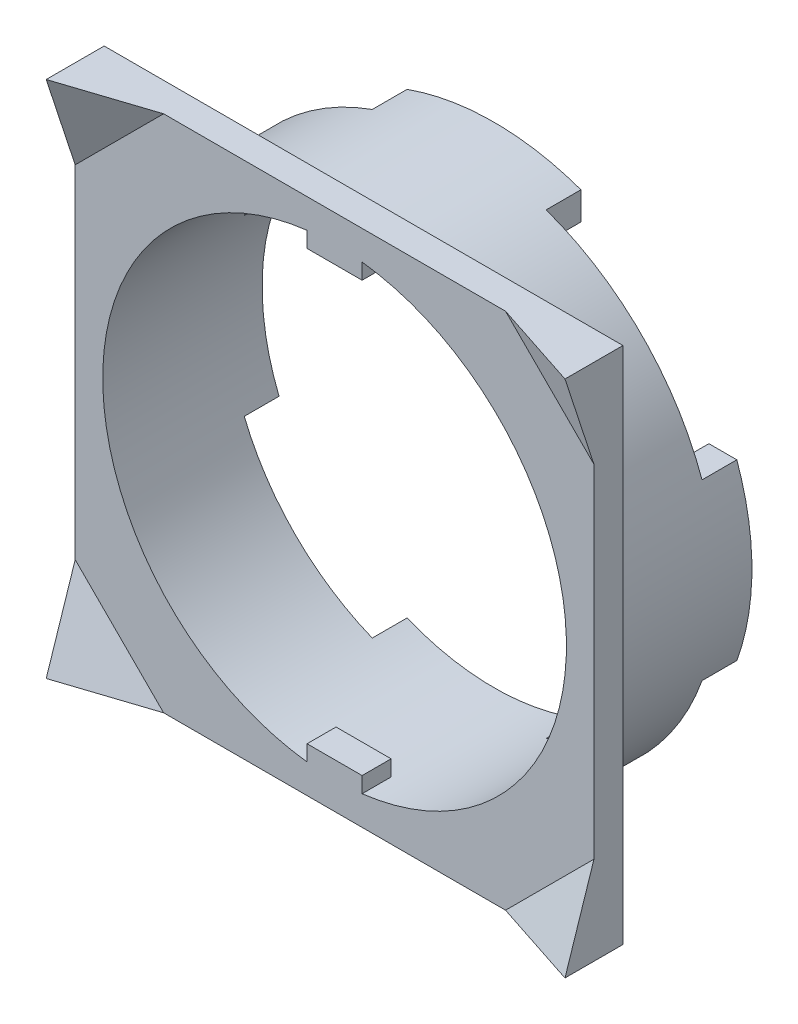
ISO-10303-21;
HEADER;
FILE_DESCRIPTION(('STEP AP214'),'2;1');
FILE_NAME('part.step','',(''),(''),'','','');
FILE_SCHEMA(('AUTOMOTIVE_DESIGN { 1 0 10303 214 1 1 1 1 }'));
ENDSEC;
DATA;
#1=APPLICATION_CONTEXT('core data for automotive mechanical design processes');
#2=APPLICATION_PROTOCOL_DEFINITION('international standard','automotive_design',2000,#1);
#3=PRODUCT_CONTEXT('',#1,'mechanical');
#4=PRODUCT('Part','Part','',(#3));
#5=PRODUCT_RELATED_PRODUCT_CATEGORY('part','',(#4));
#6=PRODUCT_DEFINITION_FORMATION('','',#4);
#7=PRODUCT_DEFINITION_CONTEXT('part definition',#1,'design');
#8=PRODUCT_DEFINITION('design','',#6,#7);
#9=PRODUCT_DEFINITION_SHAPE('','',#8);
#10=(LENGTH_UNIT() NAMED_UNIT(*) SI_UNIT(.MILLI.,.METRE.));
#11=(NAMED_UNIT(*) PLANE_ANGLE_UNIT() SI_UNIT($,.RADIAN.));
#12=(NAMED_UNIT(*) SI_UNIT($,.STERADIAN.) SOLID_ANGLE_UNIT());
#13=UNCERTAINTY_MEASURE_WITH_UNIT(LENGTH_MEASURE(1.E-05),#10,'distance_accuracy_value','');
#14=(GEOMETRIC_REPRESENTATION_CONTEXT(3) GLOBAL_UNCERTAINTY_ASSIGNED_CONTEXT((#13)) GLOBAL_UNIT_ASSIGNED_CONTEXT((#10,
#11,#12)) REPRESENTATION_CONTEXT('',''));
#15=CARTESIAN_POINT('',(0.,0.,0.));
#16=DIRECTION('',(0.,0.,1.));
#17=DIRECTION('',(1.,0.,0.));
#18=AXIS2_PLACEMENT_3D('',#15,#16,#17);
#19=CARTESIAN_POINT('',(-8.94999999999999,-8.95,3.3));
#20=DIRECTION('',(0.,0.,1.));
#21=DIRECTION('',(1.,0.,0.));
#22=AXIS2_PLACEMENT_3D('',#19,#20,#21);
#23=PLANE('',#22);
#24=DIRECTION('',(0.,1.,0.));
#25=VECTOR('',#24,1.);
#26=CARTESIAN_POINT('',(8.95,-8.95,3.3));
#27=LINE('',#26,#25);
#28=CARTESIAN_POINT('',(8.95,-8.94999999999998,3.3));
#29=VERTEX_POINT('',#28);
#30=CARTESIAN_POINT('',(8.95,8.95,3.3));
#31=VERTEX_POINT('',#30);
#32=EDGE_CURVE('E269',#29,#31,#27,.T.);
#33=ORIENTED_EDGE('',*,*,#32,.F.);
#34=DIRECTION('',(1.,0.,0.));
#35=VECTOR('',#34,1.);
#36=CARTESIAN_POINT('',(8.95,-8.95,3.3));
#37=LINE('',#36,#35);
#38=CARTESIAN_POINT('',(-8.94999999999999,-8.95,3.3));
#39=VERTEX_POINT('',#38);
#40=EDGE_CURVE('E281',#39,#29,#37,.T.);
#41=ORIENTED_EDGE('',*,*,#40,.F.);
#42=DIRECTION('',(0.,1.,0.));
#43=VECTOR('',#42,1.);
#44=CARTESIAN_POINT('',(-8.95,-8.95,3.3));
#45=LINE('',#44,#43);
#46=CARTESIAN_POINT('',(-8.95,8.94999999999999,3.3));
#47=VERTEX_POINT('',#46);
#48=EDGE_CURVE('E293',#47,#39,#45,.F.);
#49=ORIENTED_EDGE('',*,*,#48,.F.);
#50=DIRECTION('',(-1.,0.,0.));
#51=VECTOR('',#50,1.);
#52=CARTESIAN_POINT('',(8.95,8.95,3.3));
#53=LINE('',#52,#51);
#54=EDGE_CURVE('E254',#31,#47,#53,.T.);
#55=ORIENTED_EDGE('',*,*,#54,.F.);
#56=EDGE_LOOP('',(#33,#41,#49,#55));
#57=FACE_BOUND('',#56,.T.);
#58=CARTESIAN_POINT('',(0.,0.,3.3));
#59=DIRECTION('',(0.,0.,-1.));
#60=DIRECTION('',(-1.,0.,0.));
#61=AXIS2_PLACEMENT_3D('',#58,#59,#60);
#62=CIRCLE('',#61,8.9);
#63=CARTESIAN_POINT('',(-8.9,0.,3.3));
#64=VERTEX_POINT('',#63);
#65=EDGE_CURVE('E377',#64,#64,#62,.T.);
#66=ORIENTED_EDGE('',*,*,#65,.F.);
#67=EDGE_LOOP('',(#66));
#68=FACE_BOUND('',#67,.T.);
#69=ADVANCED_FACE('F15',(#57,#68),#23,.F.);
#70=CARTESIAN_POINT('',(-8.95,-8.95,3.3));
#71=DIRECTION('',(-1.,0.,0.));
#72=DIRECTION('',(0.,0.,1.));
#73=AXIS2_PLACEMENT_3D('',#70,#71,#72);
#74=PLANE('',#73);
#75=DIRECTION('',(0.,0.,1.));
#76=VECTOR('',#75,1.);
#77=CARTESIAN_POINT('',(-8.95,8.95,3.3));
#78=LINE('',#77,#76);
#79=CARTESIAN_POINT('',(-8.95,8.94999999999998,5.29999999999999));
#80=VERTEX_POINT('',#79);
#81=EDGE_CURVE('E263',#47,#80,#78,.T.);
#82=ORIENTED_EDGE('',*,*,#81,.F.);
#83=ORIENTED_EDGE('',*,*,#48,.T.);
#84=DIRECTION('',(0.,0.,1.));
#85=VECTOR('',#84,1.);
#86=CARTESIAN_POINT('',(-8.94999999999995,-8.95,3.3));
#87=LINE('',#86,#85);
#88=CARTESIAN_POINT('',(-8.94999999999997,-8.95000000000001,5.29999999999999));
#89=VERTEX_POINT('',#88);
#90=EDGE_CURVE('E284',#89,#39,#87,.F.);
#91=ORIENTED_EDGE('',*,*,#90,.F.);
#92=DIRECTION('',(0.,0.950252443169309,-0.31148080880009));
#93=VECTOR('',#92,1.);
#94=CARTESIAN_POINT('',(-8.94999999999995,-5.68037081965467,4.22825664496724));
#95=LINE('',#94,#93);
#96=CARTESIAN_POINT('',(-8.94999999999999,-5.89924240491755,4.3));
#97=VERTEX_POINT('',#96);
#98=EDGE_CURVE('E290',#89,#97,#95,.T.);
#99=ORIENTED_EDGE('',*,*,#98,.T.);
#100=DIRECTION('',(0.,1.,0.));
#101=VECTOR('',#100,1.);
#102=CARTESIAN_POINT('',(-8.95,-8.95,4.3));
#103=LINE('',#102,#101);
#104=CARTESIAN_POINT('',(-8.95,5.8992424049175,4.3));
#105=VERTEX_POINT('',#104);
#106=EDGE_CURVE('E245',#105,#97,#103,.F.);
#107=ORIENTED_EDGE('',*,*,#106,.F.);
#108=DIRECTION('',(0.,0.950252443169309,0.31148080880009));
#109=VECTOR('',#108,1.);
#110=CARTESIAN_POINT('',(-8.95,5.8992424049175,4.3));
#111=LINE('',#110,#109);
#112=EDGE_CURVE('E251',#105,#80,#111,.T.);
#113=ORIENTED_EDGE('',*,*,#112,.T.);
#114=EDGE_LOOP('',(#82,#83,#91,#99,#107,#113));
#115=FACE_BOUND('',#114,.T.);
#116=ADVANCED_FACE('F813',(#115),#74,.T.);
#117=CARTESIAN_POINT('',(-9.19238815542509,-5.65685424949243,4.3));
#118=DIRECTION('',(-0.297388357870725,-0.297388357870728,-0.907259791463231));
#119=DIRECTION('',(0.,0.950252443169309,-0.31148080880009));
#120=AXIS2_PLACEMENT_3D('',#117,#118,#119);
#121=PLANE('',#120);
#122=DIRECTION('',(-0.950252443169311,0.,0.311480808800087));
#123=VECTOR('',#122,1.);
#124=CARTESIAN_POINT('',(-5.89924240491746,-8.95,4.3));
#125=LINE('',#124,#123);
#126=CARTESIAN_POINT('',(-5.89924240491747,-8.95000000000002,4.3));
#127=VERTEX_POINT('',#126);
#128=EDGE_CURVE('E287',#127,#89,#125,.T.);
#129=ORIENTED_EDGE('',*,*,#128,.F.);
#130=DIRECTION('',(0.707106781186554,-0.707106781186541,0.));
#131=VECTOR('',#130,1.);
#132=CARTESIAN_POINT('',(-8.94999999999998,-5.89924240491755,4.3));
#133=LINE('',#132,#131);
#134=EDGE_CURVE('E450',#97,#127,#133,.T.);
#135=ORIENTED_EDGE('',*,*,#134,.F.);
#136=ORIENTED_EDGE('',*,*,#98,.F.);
#137=EDGE_LOOP('',(#129,#135,#136));
#138=FACE_BOUND('',#137,.T.);
#139=ADVANCED_FACE('F804',(#138),#121,.F.);
#140=CARTESIAN_POINT('',(8.95,-8.95,3.3));
#141=DIRECTION('',(0.,-1.,0.));
#142=DIRECTION('',(1.,0.,0.));
#143=AXIS2_PLACEMENT_3D('',#140,#141,#142);
#144=PLANE('',#143);
#145=ORIENTED_EDGE('',*,*,#90,.T.);
#146=ORIENTED_EDGE('',*,*,#40,.T.);
#147=DIRECTION('',(0.,0.,1.));
#148=VECTOR('',#147,1.);
#149=CARTESIAN_POINT('',(8.95,-8.94999999999993,3.3));
#150=LINE('',#149,#148);
#151=CARTESIAN_POINT('',(8.95000000000002,-8.94999999999995,5.29999999999999));
#152=VERTEX_POINT('',#151);
#153=EDGE_CURVE('E272',#152,#29,#150,.F.);
#154=ORIENTED_EDGE('',*,*,#153,.F.);
#155=DIRECTION('',(-0.950252443169309,0.,-0.311480808800091));
#156=VECTOR('',#155,1.);
#157=CARTESIAN_POINT('',(5.6803708196547,-8.94999999999993,4.22825664496724));
#158=LINE('',#157,#156);
#159=CARTESIAN_POINT('',(5.89924240491754,-8.94999999999999,4.3));
#160=VERTEX_POINT('',#159);
#161=EDGE_CURVE('E278',#152,#160,#158,.T.);
#162=ORIENTED_EDGE('',*,*,#161,.T.);
#163=DIRECTION('',(1.,0.,0.));
#164=VECTOR('',#163,1.);
#165=CARTESIAN_POINT('',(-8.94999999999999,-8.95000000000002,4.3));
#166=LINE('',#165,#164);
#167=EDGE_CURVE('E447',#127,#160,#166,.T.);
#168=ORIENTED_EDGE('',*,*,#167,.F.);
#169=ORIENTED_EDGE('',*,*,#128,.T.);
#170=EDGE_LOOP('',(#145,#146,#154,#162,#168,#169));
#171=FACE_BOUND('',#170,.T.);
#172=ADVANCED_FACE('F795',(#171),#144,.T.);
#173=CARTESIAN_POINT('',(5.65685424949246,-9.19238815542507,4.3));
#174=DIRECTION('',(0.297388357870729,-0.297388357870724,-0.907259791463231));
#175=DIRECTION('',(-0.950252443169309,0.,-0.311480808800091));
#176=AXIS2_PLACEMENT_3D('',#173,#174,#175);
#177=PLANE('',#176);
#178=DIRECTION('',(0.,-0.950252443169309,0.31148080880009));
#179=VECTOR('',#178,1.);
#180=CARTESIAN_POINT('',(8.95,-5.89924240491747,4.3));
#181=LINE('',#180,#179);
#182=CARTESIAN_POINT('',(8.95,-5.89924240491747,4.3));
#183=VERTEX_POINT('',#182);
#184=EDGE_CURVE('E275',#183,#152,#181,.T.);
#185=ORIENTED_EDGE('',*,*,#184,.F.);
#186=DIRECTION('',(0.707106781186541,0.707106781186554,0.));
#187=VECTOR('',#186,1.);
#188=CARTESIAN_POINT('',(5.89924240491754,-8.94999999999999,4.3));
#189=LINE('',#188,#187);
#190=EDGE_CURVE('E444',#160,#183,#189,.T.);
#191=ORIENTED_EDGE('',*,*,#190,.F.);
#192=ORIENTED_EDGE('',*,*,#161,.F.);
#193=EDGE_LOOP('',(#185,#191,#192));
#194=FACE_BOUND('',#193,.T.);
#195=ADVANCED_FACE('F786',(#194),#177,.F.);
#196=CARTESIAN_POINT('',(8.95,-8.95,3.3));
#197=DIRECTION('',(1.,0.,0.));
#198=DIRECTION('',(0.,1.,0.));
#199=AXIS2_PLACEMENT_3D('',#196,#197,#198);
#200=PLANE('',#199);
#201=ORIENTED_EDGE('',*,*,#153,.T.);
#202=ORIENTED_EDGE('',*,*,#32,.T.);
#203=DIRECTION('',(0.,0.,1.));
#204=VECTOR('',#203,1.);
#205=CARTESIAN_POINT('',(8.95,8.95,3.3));
#206=LINE('',#205,#204);
#207=CARTESIAN_POINT('',(8.95,8.95,5.3));
#208=VERTEX_POINT('',#207);
#209=EDGE_CURVE('E257',#208,#31,#206,.F.);
#210=ORIENTED_EDGE('',*,*,#209,.F.);
#211=DIRECTION('',(0.,-0.95025244316931,-0.311480808800088));
#212=VECTOR('',#211,1.);
#213=CARTESIAN_POINT('',(8.95,8.95,5.3));
#214=LINE('',#213,#212);
#215=CARTESIAN_POINT('',(8.95,5.89924240491749,4.3));
#216=VERTEX_POINT('',#215);
#217=EDGE_CURVE('E266',#208,#216,#214,.T.);
#218=ORIENTED_EDGE('',*,*,#217,.T.);
#219=DIRECTION('',(0.,1.,0.));
#220=VECTOR('',#219,1.);
#221=CARTESIAN_POINT('',(8.95,-8.95,4.3));
#222=LINE('',#221,#220);
#223=EDGE_CURVE('E441',#183,#216,#222,.T.);
#224=ORIENTED_EDGE('',*,*,#223,.F.);
#225=ORIENTED_EDGE('',*,*,#184,.T.);
#226=EDGE_LOOP('',(#201,#202,#210,#218,#224,#225));
#227=FACE_BOUND('',#226,.T.);
#228=ADVANCED_FACE('F777',(#227),#200,.T.);
#229=CARTESIAN_POINT('',(9.19238815542513,5.65685424949236,4.3));
#230=DIRECTION('',(0.297388357870727,0.297388357870726,-0.907259791463231));
#231=DIRECTION('',(-0.95025244316931,0.,-0.311480808800089));
#232=AXIS2_PLACEMENT_3D('',#229,#230,#231);
#233=PLANE('',#232);
#234=DIRECTION('',(0.95025244316931,0.,0.311480808800089));
#235=VECTOR('',#234,1.);
#236=CARTESIAN_POINT('',(5.8992424049175,8.95,4.3));
#237=LINE('',#236,#235);
#238=CARTESIAN_POINT('',(5.8992424049175,8.95,4.3));
#239=VERTEX_POINT('',#238);
#240=EDGE_CURVE('E260',#239,#208,#237,.T.);
#241=ORIENTED_EDGE('',*,*,#240,.F.);
#242=DIRECTION('',(-0.707106781186548,0.707106781186548,0.));
#243=VECTOR('',#242,1.);
#244=CARTESIAN_POINT('',(8.95,5.8992424049175,4.3));
#245=LINE('',#244,#243);
#246=EDGE_CURVE('E438',#216,#239,#245,.T.);
#247=ORIENTED_EDGE('',*,*,#246,.F.);
#248=ORIENTED_EDGE('',*,*,#217,.F.);
#249=EDGE_LOOP('',(#241,#247,#248));
#250=FACE_BOUND('',#249,.T.);
#251=ADVANCED_FACE('F768',(#250),#233,.F.);
#252=CARTESIAN_POINT('',(8.95,8.95,3.3));
#253=DIRECTION('',(0.,1.,0.));
#254=DIRECTION('',(-1.,0.,0.));
#255=AXIS2_PLACEMENT_3D('',#252,#253,#254);
#256=PLANE('',#255);
#257=ORIENTED_EDGE('',*,*,#209,.T.);
#258=ORIENTED_EDGE('',*,*,#54,.T.);
#259=ORIENTED_EDGE('',*,*,#81,.T.);
#260=DIRECTION('',(-0.95025244316931,0.,0.311480808800089));
#261=VECTOR('',#260,1.);
#262=CARTESIAN_POINT('',(-5.68037081965464,8.94999999999998,4.22825664496724));
#263=LINE('',#262,#261);
#264=CARTESIAN_POINT('',(-5.89924240491752,8.94999999999999,4.3));
#265=VERTEX_POINT('',#264);
#266=EDGE_CURVE('E241',#80,#265,#263,.F.);
#267=ORIENTED_EDGE('',*,*,#266,.T.);
#268=DIRECTION('',(1.,0.,0.));
#269=VECTOR('',#268,1.);
#270=CARTESIAN_POINT('',(-8.94999999999999,8.95,4.3));
#271=LINE('',#270,#269);
#272=EDGE_CURVE('E436',#239,#265,#271,.F.);
#273=ORIENTED_EDGE('',*,*,#272,.F.);
#274=ORIENTED_EDGE('',*,*,#240,.T.);
#275=EDGE_LOOP('',(#257,#258,#259,#267,#273,#274));
#276=FACE_BOUND('',#275,.T.);
#277=ADVANCED_FACE('F759',(#276),#256,.T.);
#278=CARTESIAN_POINT('',(-5.65685424949239,9.19238815542511,4.3));
#279=DIRECTION('',(-0.297388357870727,0.297388357870726,-0.907259791463231));
#280=DIRECTION('',(-0.95025244316931,0.,0.311480808800089));
#281=AXIS2_PLACEMENT_3D('',#278,#279,#280);
#282=PLANE('',#281);
#283=ORIENTED_EDGE('',*,*,#112,.F.);
#284=DIRECTION('',(-0.707106781186547,-0.707106781186548,0.));
#285=VECTOR('',#284,1.);
#286=CARTESIAN_POINT('',(-5.89924240491751,8.94999999999999,4.3));
#287=LINE('',#286,#285);
#288=EDGE_CURVE('E431',#265,#105,#287,.T.);
#289=ORIENTED_EDGE('',*,*,#288,.F.);
#290=ORIENTED_EDGE('',*,*,#266,.F.);
#291=EDGE_LOOP('',(#283,#289,#290));
#292=FACE_BOUND('',#291,.T.);
#293=ADVANCED_FACE('F751',(#292),#282,.F.);
#294=CARTESIAN_POINT('',(0.95,7.4,3.3));
#295=DIRECTION('',(0.,1.,0.));
#296=DIRECTION('',(0.,0.,1.));
#297=AXIS2_PLACEMENT_3D('',#294,#295,#296);
#298=PLANE('',#297);
#299=DIRECTION('',(1.,0.,0.));
#300=VECTOR('',#299,1.);
#301=CARTESIAN_POINT('',(0.,7.4,3.3));
#302=LINE('',#301,#300);
#303=CARTESIAN_POINT('',(-0.95,7.4,3.3));
#304=VERTEX_POINT('',#303);
#305=CARTESIAN_POINT('',(0.95,7.4,3.3));
#306=VERTEX_POINT('',#305);
#307=EDGE_CURVE('E161',#304,#306,#302,.T.);
#308=ORIENTED_EDGE('',*,*,#307,.T.);
#309=DIRECTION('',(0.,0.,1.));
#310=VECTOR('',#309,1.);
#311=CARTESIAN_POINT('',(0.95,7.4,3.3));
#312=LINE('',#311,#310);
#313=CARTESIAN_POINT('',(0.95,7.4,4.3));
#314=VERTEX_POINT('',#313);
#315=EDGE_CURVE('E228',#306,#314,#312,.T.);
#316=ORIENTED_EDGE('',*,*,#315,.T.);
#317=DIRECTION('',(1.,0.,0.));
#318=VECTOR('',#317,1.);
#319=CARTESIAN_POINT('',(-8.94999999999999,7.4,4.3));
#320=LINE('',#319,#318);
#321=CARTESIAN_POINT('',(-0.95,7.4,4.3));
#322=VERTEX_POINT('',#321);
#323=EDGE_CURVE('E234',#322,#314,#320,.T.);
#324=ORIENTED_EDGE('',*,*,#323,.F.);
#325=DIRECTION('',(0.,0.,1.));
#326=VECTOR('',#325,1.);
#327=CARTESIAN_POINT('',(-0.95,7.4,3.3));
#328=LINE('',#327,#326);
#329=EDGE_CURVE('E174',#322,#304,#328,.F.);
#330=ORIENTED_EDGE('',*,*,#329,.T.);
#331=EDGE_LOOP('',(#308,#316,#324,#330));
#332=FACE_BOUND('',#331,.T.);
#333=ADVANCED_FACE('F519',(#332),#298,.F.);
#334=CARTESIAN_POINT('',(0.950000000000001,-7.4,3.3));
#335=DIRECTION('',(0.,-1.,0.));
#336=DIRECTION('',(0.,0.,-1.));
#337=AXIS2_PLACEMENT_3D('',#334,#335,#336);
#338=PLANE('',#337);
#339=DIRECTION('',(1.,0.,0.));
#340=VECTOR('',#339,1.);
#341=CARTESIAN_POINT('',(0.,-7.4,3.3));
#342=LINE('',#341,#340);
#343=CARTESIAN_POINT('',(0.95,-7.4,3.3));
#344=VERTEX_POINT('',#343);
#345=CARTESIAN_POINT('',(-0.950000000000001,-7.4,3.3));
#346=VERTEX_POINT('',#345);
#347=EDGE_CURVE('E296',#344,#346,#342,.F.);
#348=ORIENTED_EDGE('',*,*,#347,.T.);
#349=DIRECTION('',(0.,0.,1.));
#350=VECTOR('',#349,1.);
#351=CARTESIAN_POINT('',(-0.950000000000001,-7.4,3.3));
#352=LINE('',#351,#350);
#353=CARTESIAN_POINT('',(-0.950000000000001,-7.4,4.3));
#354=VERTEX_POINT('',#353);
#355=EDGE_CURVE('E184',#346,#354,#352,.T.);
#356=ORIENTED_EDGE('',*,*,#355,.T.);
#357=DIRECTION('',(1.,0.,0.));
#358=VECTOR('',#357,1.);
#359=CARTESIAN_POINT('',(-8.94999999999999,-7.4,4.3));
#360=LINE('',#359,#358);
#361=CARTESIAN_POINT('',(0.95,-7.4,4.3));
#362=VERTEX_POINT('',#361);
#363=EDGE_CURVE('E212',#362,#354,#360,.F.);
#364=ORIENTED_EDGE('',*,*,#363,.F.);
#365=DIRECTION('',(0.,0.,1.));
#366=VECTOR('',#365,1.);
#367=CARTESIAN_POINT('',(0.950000000000001,-7.4,3.3));
#368=LINE('',#367,#366);
#369=EDGE_CURVE('E199',#362,#344,#368,.F.);
#370=ORIENTED_EDGE('',*,*,#369,.T.);
#371=EDGE_LOOP('',(#348,#356,#364,#370));
#372=FACE_BOUND('',#371,.T.);
#373=ADVANCED_FACE('F217',(#372),#338,.F.);
#374=CARTESIAN_POINT('',(-0.95,7.94339348137809,3.3));
#375=DIRECTION('',(1.,0.,0.));
#376=DIRECTION('',(0.,1.,0.));
#377=AXIS2_PLACEMENT_3D('',#374,#375,#376);
#378=PLANE('',#377);
#379=DIRECTION('',(0.,1.,0.));
#380=VECTOR('',#379,1.);
#381=CARTESIAN_POINT('',(-0.95,0.,3.3));
#382=LINE('',#381,#380);
#383=CARTESIAN_POINT('',(-0.95,7.94339348137809,3.3));
#384=VERTEX_POINT('',#383);
#385=EDGE_CURVE('E240',#384,#304,#382,.F.);
#386=ORIENTED_EDGE('',*,*,#385,.T.);
#387=ORIENTED_EDGE('',*,*,#329,.F.);
#388=DIRECTION('',(0.,1.,0.));
#389=VECTOR('',#388,1.);
#390=CARTESIAN_POINT('',(-0.95,-8.95,4.3));
#391=LINE('',#390,#389);
#392=CARTESIAN_POINT('',(-0.95,7.94339348137809,4.3));
#393=VERTEX_POINT('',#392);
#394=EDGE_CURVE('E236',#393,#322,#391,.F.);
#395=ORIENTED_EDGE('',*,*,#394,.F.);
#396=DIRECTION('',(0.,0.,1.));
#397=VECTOR('',#396,1.);
#398=CARTESIAN_POINT('',(-0.95,7.94339348137809,-1.2));
#399=LINE('',#398,#397);
#400=EDGE_CURVE('E218',#393,#384,#399,.F.);
#401=ORIENTED_EDGE('',*,*,#400,.T.);
#402=EDGE_LOOP('',(#386,#387,#395,#401));
#403=FACE_BOUND('',#402,.T.);
#404=ADVANCED_FACE('F506',(#403),#378,.F.);
#405=CARTESIAN_POINT('',(0.,0.,3.3));
#406=DIRECTION('',(0.,0.,1.));
#407=DIRECTION('',(1.,0.,0.));
#408=AXIS2_PLACEMENT_3D('',#405,#406,#407);
#409=PLANE('',#408);
#410=ORIENTED_EDGE('',*,*,#307,.F.);
#411=ORIENTED_EDGE('',*,*,#385,.F.);
#412=CARTESIAN_POINT('',(0.,0.,3.3));
#413=DIRECTION('',(0.,0.,1.));
#414=DIRECTION('',(1.,0.,0.));
#415=AXIS2_PLACEMENT_3D('',#412,#413,#414);
#416=CIRCLE('',#415,8.);
#417=CARTESIAN_POINT('',(0.95,7.94339348137809,3.3));
#418=VERTEX_POINT('',#417);
#419=EDGE_CURVE('E221',#384,#418,#416,.F.);
#420=ORIENTED_EDGE('',*,*,#419,.T.);
#421=DIRECTION('',(0.,-1.,0.));
#422=VECTOR('',#421,1.);
#423=CARTESIAN_POINT('',(0.95,7.94339348137809,3.3));
#424=LINE('',#423,#422);
#425=EDGE_CURVE('E231',#418,#306,#424,.T.);
#426=ORIENTED_EDGE('',*,*,#425,.T.);
#427=EDGE_LOOP('',(#410,#411,#420,#426));
#428=FACE_BOUND('',#427,.T.);
#429=ADVANCED_FACE('F510',(#428),#409,.F.);
#430=CARTESIAN_POINT('',(0.95,7.94339348137809,3.3));
#431=DIRECTION('',(-1.,0.,0.));
#432=DIRECTION('',(0.,-1.,0.));
#433=AXIS2_PLACEMENT_3D('',#430,#431,#432);
#434=PLANE('',#433);
#435=ORIENTED_EDGE('',*,*,#425,.F.);
#436=DIRECTION('',(0.,0.,1.));
#437=VECTOR('',#436,1.);
#438=CARTESIAN_POINT('',(0.950000000000001,7.94339348137809,-1.2));
#439=LINE('',#438,#437);
#440=CARTESIAN_POINT('',(0.95,7.94339348137809,4.3));
#441=VERTEX_POINT('',#440);
#442=EDGE_CURVE('E367',#418,#441,#439,.T.);
#443=ORIENTED_EDGE('',*,*,#442,.T.);
#444=DIRECTION('',(0.,1.,0.));
#445=VECTOR('',#444,1.);
#446=CARTESIAN_POINT('',(0.95,-8.95,4.3));
#447=LINE('',#446,#445);
#448=EDGE_CURVE('E215',#314,#441,#447,.T.);
#449=ORIENTED_EDGE('',*,*,#448,.F.);
#450=ORIENTED_EDGE('',*,*,#315,.F.);
#451=EDGE_LOOP('',(#435,#443,#449,#450));
#452=FACE_BOUND('',#451,.T.);
#453=ADVANCED_FACE('F517',(#452),#434,.F.);
#454=CARTESIAN_POINT('',(8.37914076740569,2.99999999999996,-1.2));
#455=DIRECTION('',(0.,-1.,0.));
#456=DIRECTION('',(1.,0.,0.));
#457=AXIS2_PLACEMENT_3D('',#454,#455,#456);
#458=PLANE('',#457);
#459=DIRECTION('',(1.,0.,0.));
#460=VECTOR('',#459,1.);
#461=CARTESIAN_POINT('',(0.,2.99999999999996,-1.2));
#462=LINE('',#461,#460);
#463=CARTESIAN_POINT('',(8.3791407674057,2.99999999999997,-1.2));
#464=VERTEX_POINT('',#463);
#465=CARTESIAN_POINT('',(7.41619848709568,2.99999999999996,-1.2));
#466=VERTEX_POINT('',#465);
#467=EDGE_CURVE('E207',#464,#466,#462,.F.);
#468=ORIENTED_EDGE('',*,*,#467,.T.);
#469=DIRECTION('',(0.,0.,1.));
#470=VECTOR('',#469,1.);
#471=CARTESIAN_POINT('',(7.41619848709568,2.99999999999996,-1.2));
#472=LINE('',#471,#470);
#473=CARTESIAN_POINT('',(7.41619848709568,2.99999999999997,0.));
#474=VERTEX_POINT('',#473);
#475=EDGE_CURVE('E364',#466,#474,#472,.T.);
#476=ORIENTED_EDGE('',*,*,#475,.T.);
#477=DIRECTION('',(1.,0.,0.));
#478=VECTOR('',#477,1.);
#479=CARTESIAN_POINT('',(0.,2.99999999999997,0.));
#480=LINE('',#479,#478);
#481=CARTESIAN_POINT('',(8.3791407674057,2.99999999999997,0.));
#482=VERTEX_POINT('',#481);
#483=EDGE_CURVE('E230',#474,#482,#480,.T.);
#484=ORIENTED_EDGE('',*,*,#483,.T.);
#485=DIRECTION('',(0.,0.,-1.));
#486=VECTOR('',#485,1.);
#487=CARTESIAN_POINT('',(8.3791407674057,2.99999999999997,3.8));
#488=LINE('',#487,#486);
#489=EDGE_CURVE('E152',#464,#482,#488,.F.);
#490=ORIENTED_EDGE('',*,*,#489,.F.);
#491=EDGE_LOOP('',(#468,#476,#484,#490));
#492=FACE_BOUND('',#491,.T.);
#493=ADVANCED_FACE('F706',(#492),#458,.F.);
#494=CARTESIAN_POINT('',(0.,0.,0.));
#495=DIRECTION('',(0.,0.,1.));
#496=DIRECTION('',(1.,0.,0.));
#497=AXIS2_PLACEMENT_3D('',#494,#495,#496);
#498=PLANE('',#497);
#499=DIRECTION('',(0.,-1.,0.));
#500=VECTOR('',#499,1.);
#501=CARTESIAN_POINT('',(3.,8.37914076740568,0.));
#502=LINE('',#501,#500);
#503=CARTESIAN_POINT('',(3.,7.41619848709566,0.));
#504=VERTEX_POINT('',#503);
#505=CARTESIAN_POINT('',(3.,8.37914076740569,0.));
#506=VERTEX_POINT('',#505);
#507=EDGE_CURVE('E490',#504,#506,#502,.F.);
#508=ORIENTED_EDGE('',*,*,#507,.T.);
#509=CARTESIAN_POINT('',(0.,0.,0.));
#510=DIRECTION('',(0.,0.,-1.));
#511=DIRECTION('',(-1.,0.,0.));
#512=AXIS2_PLACEMENT_3D('',#509,#510,#511);
#513=CIRCLE('',#512,8.9);
#514=EDGE_CURVE('E18',#482,#506,#513,.F.);
#515=ORIENTED_EDGE('',*,*,#514,.F.);
#516=ORIENTED_EDGE('',*,*,#483,.F.);
#517=CARTESIAN_POINT('',(0.,0.,0.));
#518=DIRECTION('',(0.,0.,1.));
#519=DIRECTION('',(1.,0.,0.));
#520=AXIS2_PLACEMENT_3D('',#517,#518,#519);
#521=CIRCLE('',#520,8.);
#522=EDGE_CURVE('E361',#474,#504,#521,.T.);
#523=ORIENTED_EDGE('',*,*,#522,.T.);
#524=EDGE_LOOP('',(#508,#515,#516,#523));
#525=FACE_BOUND('',#524,.T.);
#526=ADVANCED_FACE('F697',(#525),#498,.F.);
#527=CARTESIAN_POINT('',(3.,8.37914076740568,-1.2));
#528=DIRECTION('',(-1.,0.,0.));
#529=DIRECTION('',(0.,-1.,0.));
#530=AXIS2_PLACEMENT_3D('',#527,#528,#529);
#531=PLANE('',#530);
#532=DIRECTION('',(0.,1.,0.));
#533=VECTOR('',#532,1.);
#534=CARTESIAN_POINT('',(3.,0.,-1.2));
#535=LINE('',#534,#533);
#536=CARTESIAN_POINT('',(3.,8.37914076740569,-1.2));
#537=VERTEX_POINT('',#536);
#538=CARTESIAN_POINT('',(3.,7.41619848709566,-1.2));
#539=VERTEX_POINT('',#538);
#540=EDGE_CURVE('E397',#537,#539,#535,.F.);
#541=ORIENTED_EDGE('',*,*,#540,.F.);
#542=DIRECTION('',(0.,0.,-1.));
#543=VECTOR('',#542,1.);
#544=CARTESIAN_POINT('',(3.,8.37914076740569,3.8));
#545=LINE('',#544,#543);
#546=EDGE_CURVE('E320',#506,#537,#545,.T.);
#547=ORIENTED_EDGE('',*,*,#546,.F.);
#548=ORIENTED_EDGE('',*,*,#507,.F.);
#549=DIRECTION('',(0.,0.,1.));
#550=VECTOR('',#549,1.);
#551=CARTESIAN_POINT('',(3.,7.41619848709566,-1.2));
#552=LINE('',#551,#550);
#553=EDGE_CURVE('E360',#504,#539,#552,.F.);
#554=ORIENTED_EDGE('',*,*,#553,.T.);
#555=EDGE_LOOP('',(#541,#547,#548,#554));
#556=FACE_BOUND('',#555,.T.);
#557=ADVANCED_FACE('F689',(#556),#531,.F.);
#558=CARTESIAN_POINT('',(0.,0.,-1.2));
#559=DIRECTION('',(0.,0.,-1.));
#560=DIRECTION('',(-1.,0.,0.));
#561=AXIS2_PLACEMENT_3D('',#558,#559,#560);
#562=PLANE('',#561);
#563=CARTESIAN_POINT('',(0.,0.,-1.2));
#564=DIRECTION('',(0.,0.,-1.));
#565=DIRECTION('',(-1.,0.,0.));
#566=AXIS2_PLACEMENT_3D('',#563,#564,#565);
#567=CIRCLE('',#566,8.9);
#568=CARTESIAN_POINT('',(-3.,8.37914076740569,-1.2));
#569=VERTEX_POINT('',#568);
#570=EDGE_CURVE('E319',#537,#569,#567,.F.);
#571=ORIENTED_EDGE('',*,*,#570,.F.);
#572=ORIENTED_EDGE('',*,*,#540,.T.);
#573=CARTESIAN_POINT('',(0.,0.,-1.2));
#574=DIRECTION('',(0.,0.,1.));
#575=DIRECTION('',(1.,0.,0.));
#576=AXIS2_PLACEMENT_3D('',#573,#574,#575);
#577=CIRCLE('',#576,8.);
#578=CARTESIAN_POINT('',(-3.,7.41619848709566,-1.2));
#579=VERTEX_POINT('',#578);
#580=EDGE_CURVE('E357',#539,#579,#577,.T.);
#581=ORIENTED_EDGE('',*,*,#580,.T.);
#582=DIRECTION('',(0.,1.,0.));
#583=VECTOR('',#582,1.);
#584=CARTESIAN_POINT('',(-3.,8.37914076740569,-1.2));
#585=LINE('',#584,#583);
#586=EDGE_CURVE('E390',#579,#569,#585,.T.);
#587=ORIENTED_EDGE('',*,*,#586,.T.);
#588=EDGE_LOOP('',(#571,#572,#581,#587));
#589=FACE_BOUND('',#588,.T.);
#590=ADVANCED_FACE('F391',(#589),#562,.T.);
#591=CARTESIAN_POINT('',(-3.,8.37914076740569,-1.2));
#592=DIRECTION('',(1.,0.,0.));
#593=DIRECTION('',(0.,1.,0.));
#594=AXIS2_PLACEMENT_3D('',#591,#592,#593);
#595=PLANE('',#594);
#596=ORIENTED_EDGE('',*,*,#586,.F.);
#597=DIRECTION('',(0.,0.,1.));
#598=VECTOR('',#597,1.);
#599=CARTESIAN_POINT('',(-3.,7.41619848709566,-1.2));
#600=LINE('',#599,#598);
#601=CARTESIAN_POINT('',(-3.,7.41619848709566,0.));
#602=VERTEX_POINT('',#601);
#603=EDGE_CURVE('E356',#579,#602,#600,.T.);
#604=ORIENTED_EDGE('',*,*,#603,.T.);
#605=DIRECTION('',(0.,1.,0.));
#606=VECTOR('',#605,1.);
#607=CARTESIAN_POINT('',(-3.,0.,0.));
#608=LINE('',#607,#606);
#609=CARTESIAN_POINT('',(-3.,8.37914076740569,0.));
#610=VERTEX_POINT('',#609);
#611=EDGE_CURVE('E396',#602,#610,#608,.T.);
#612=ORIENTED_EDGE('',*,*,#611,.T.);
#613=DIRECTION('',(0.,0.,-1.));
#614=VECTOR('',#613,1.);
#615=CARTESIAN_POINT('',(-3.,8.37914076740569,3.8));
#616=LINE('',#615,#614);
#617=EDGE_CURVE('E316',#569,#610,#616,.F.);
#618=ORIENTED_EDGE('',*,*,#617,.F.);
#619=EDGE_LOOP('',(#596,#604,#612,#618));
#620=FACE_BOUND('',#619,.T.);
#621=ADVANCED_FACE('F399',(#620),#595,.F.);
#622=CARTESIAN_POINT('',(0.,0.,0.));
#623=DIRECTION('',(0.,0.,1.));
#624=DIRECTION('',(1.,0.,0.));
#625=AXIS2_PLACEMENT_3D('',#622,#623,#624);
#626=PLANE('',#625);
#627=DIRECTION('',(1.,0.,0.));
#628=VECTOR('',#627,1.);
#629=CARTESIAN_POINT('',(-8.37914076740567,3.00000000000003,0.));
#630=LINE('',#629,#628);
#631=CARTESIAN_POINT('',(-7.41619848709565,3.00000000000003,0.));
#632=VERTEX_POINT('',#631);
#633=CARTESIAN_POINT('',(-8.37914076740568,3.00000000000003,0.));
#634=VERTEX_POINT('',#633);
#635=EDGE_CURVE('E301',#632,#634,#630,.F.);
#636=ORIENTED_EDGE('',*,*,#635,.T.);
#637=CARTESIAN_POINT('',(0.,0.,0.));
#638=DIRECTION('',(0.,0.,-1.));
#639=DIRECTION('',(-1.,0.,0.));
#640=AXIS2_PLACEMENT_3D('',#637,#638,#639);
#641=CIRCLE('',#640,8.9);
#642=EDGE_CURVE('E318',#610,#634,#641,.F.);
#643=ORIENTED_EDGE('',*,*,#642,.F.);
#644=ORIENTED_EDGE('',*,*,#611,.F.);
#645=CARTESIAN_POINT('',(0.,0.,0.));
#646=DIRECTION('',(0.,0.,1.));
#647=DIRECTION('',(1.,0.,0.));
#648=AXIS2_PLACEMENT_3D('',#645,#646,#647);
#649=CIRCLE('',#648,8.);
#650=EDGE_CURVE('E352',#602,#632,#649,.T.);
#651=ORIENTED_EDGE('',*,*,#650,.T.);
#652=EDGE_LOOP('',(#636,#643,#644,#651));
#653=FACE_BOUND('',#652,.T.);
#654=ADVANCED_FACE('F405',(#653),#626,.F.);
#655=CARTESIAN_POINT('',(-8.37914076740567,3.00000000000003,-1.2));
#656=DIRECTION('',(0.,-1.,0.));
#657=DIRECTION('',(1.,0.,0.));
#658=AXIS2_PLACEMENT_3D('',#655,#656,#657);
#659=PLANE('',#658);
#660=DIRECTION('',(1.,0.,0.));
#661=VECTOR('',#660,1.);
#662=CARTESIAN_POINT('',(0.,3.00000000000003,-1.2));
#663=LINE('',#662,#661);
#664=CARTESIAN_POINT('',(-7.41619848709565,3.00000000000003,-1.2));
#665=VERTEX_POINT('',#664);
#666=CARTESIAN_POINT('',(-8.37914076740568,3.00000000000003,-1.2));
#667=VERTEX_POINT('',#666);
#668=EDGE_CURVE('E351',#665,#667,#663,.F.);
#669=ORIENTED_EDGE('',*,*,#668,.T.);
#670=DIRECTION('',(0.,0.,-1.));
#671=VECTOR('',#670,1.);
#672=CARTESIAN_POINT('',(-8.37914076740568,3.00000000000003,3.8));
#673=LINE('',#672,#671);
#674=EDGE_CURVE('E381',#634,#667,#673,.T.);
#675=ORIENTED_EDGE('',*,*,#674,.F.);
#676=ORIENTED_EDGE('',*,*,#635,.F.);
#677=DIRECTION('',(0.,0.,1.));
#678=VECTOR('',#677,1.);
#679=CARTESIAN_POINT('',(-7.41619848709565,3.00000000000003,-1.2));
#680=LINE('',#679,#678);
#681=EDGE_CURVE('E355',#632,#665,#680,.F.);
#682=ORIENTED_EDGE('',*,*,#681,.T.);
#683=EDGE_LOOP('',(#669,#675,#676,#682));
#684=FACE_BOUND('',#683,.T.);
#685=ADVANCED_FACE('F413',(#684),#659,.F.);
#686=CARTESIAN_POINT('',(0.,0.,3.8));
#687=DIRECTION('',(0.,0.,-1.));
#688=DIRECTION('',(-1.,0.,0.));
#689=AXIS2_PLACEMENT_3D('',#686,#687,#688);
#690=CYLINDRICAL_SURFACE('',#689,8.9);
#691=ORIENTED_EDGE('',*,*,#65,.T.);
#692=EDGE_LOOP('',(#691));
#693=FACE_BOUND('',#692,.T.);
#694=DIRECTION('',(0.,0.,1.));
#695=VECTOR('',#694,1.);
#696=CARTESIAN_POINT('',(8.37914076740568,-3.00000000000004,-1.2));
#697=LINE('',#696,#695);
#698=CARTESIAN_POINT('',(8.37914076740568,-3.00000000000004,0.));
#699=VERTEX_POINT('',#698);
#700=CARTESIAN_POINT('',(8.37914076740568,-3.00000000000003,-1.2));
#701=VERTEX_POINT('',#700);
#702=EDGE_CURVE('E302',#699,#701,#697,.F.);
#703=ORIENTED_EDGE('',*,*,#702,.T.);
#704=CARTESIAN_POINT('',(0.,0.,-1.2));
#705=DIRECTION('',(0.,0.,-1.));
#706=DIRECTION('',(-1.,0.,0.));
#707=AXIS2_PLACEMENT_3D('',#704,#705,#706);
#708=CIRCLE('',#707,8.9);
#709=EDGE_CURVE('E368',#701,#464,#708,.F.);
#710=ORIENTED_EDGE('',*,*,#709,.T.);
#711=ORIENTED_EDGE('',*,*,#489,.T.);
#712=ORIENTED_EDGE('',*,*,#514,.T.);
#713=ORIENTED_EDGE('',*,*,#546,.T.);
#714=ORIENTED_EDGE('',*,*,#570,.T.);
#715=ORIENTED_EDGE('',*,*,#617,.T.);
#716=ORIENTED_EDGE('',*,*,#642,.T.);
#717=ORIENTED_EDGE('',*,*,#674,.T.);
#718=CARTESIAN_POINT('',(0.,0.,-1.2));
#719=DIRECTION('',(0.,0.,-1.));
#720=DIRECTION('',(-1.,0.,0.));
#721=AXIS2_PLACEMENT_3D('',#718,#719,#720);
#722=CIRCLE('',#721,8.9);
#723=CARTESIAN_POINT('',(-8.3791407674057,-2.99999999999997,-1.2));
#724=VERTEX_POINT('',#723);
#725=EDGE_CURVE('E347',#667,#724,#722,.F.);
#726=ORIENTED_EDGE('',*,*,#725,.T.);
#727=DIRECTION('',(0.,0.,1.));
#728=VECTOR('',#727,1.);
#729=CARTESIAN_POINT('',(-8.3791407674057,-2.99999999999997,-1.2));
#730=LINE('',#729,#728);
#731=CARTESIAN_POINT('',(-8.3791407674057,-2.99999999999997,0.));
#732=VERTEX_POINT('',#731);
#733=EDGE_CURVE('E380',#724,#732,#730,.T.);
#734=ORIENTED_EDGE('',*,*,#733,.T.);
#735=CARTESIAN_POINT('',(0.,0.,0.));
#736=DIRECTION('',(0.,0.,-1.));
#737=DIRECTION('',(-1.,0.,0.));
#738=AXIS2_PLACEMENT_3D('',#735,#736,#737);
#739=CIRCLE('',#738,8.9);
#740=CARTESIAN_POINT('',(-3.,-8.37914076740569,0.));
#741=VERTEX_POINT('',#740);
#742=EDGE_CURVE('E374',#732,#741,#739,.F.);
#743=ORIENTED_EDGE('',*,*,#742,.T.);
#744=DIRECTION('',(0.,0.,1.));
#745=VECTOR('',#744,1.);
#746=CARTESIAN_POINT('',(-3.,-8.37914076740568,-1.2));
#747=LINE('',#746,#745);
#748=CARTESIAN_POINT('',(-3.,-8.37914076740569,-1.2));
#749=VERTEX_POINT('',#748);
#750=EDGE_CURVE('E311',#741,#749,#747,.F.);
#751=ORIENTED_EDGE('',*,*,#750,.T.);
#752=CARTESIAN_POINT('',(0.,0.,-1.2));
#753=DIRECTION('',(0.,0.,-1.));
#754=DIRECTION('',(-1.,0.,0.));
#755=AXIS2_PLACEMENT_3D('',#752,#753,#754);
#756=CIRCLE('',#755,8.9);
#757=CARTESIAN_POINT('',(3.,-8.37914076740569,-1.2));
#758=VERTEX_POINT('',#757);
#759=EDGE_CURVE('E314',#758,#749,#756,.T.);
#760=ORIENTED_EDGE('',*,*,#759,.F.);
#761=DIRECTION('',(0.,0.,1.));
#762=VECTOR('',#761,1.);
#763=CARTESIAN_POINT('',(3.,-8.37914076740569,-1.2));
#764=LINE('',#763,#762);
#765=CARTESIAN_POINT('',(3.,-8.37914076740569,0.));
#766=VERTEX_POINT('',#765);
#767=EDGE_CURVE('E307',#758,#766,#764,.T.);
#768=ORIENTED_EDGE('',*,*,#767,.T.);
#769=CARTESIAN_POINT('',(0.,0.,0.));
#770=DIRECTION('',(0.,0.,-1.));
#771=DIRECTION('',(-1.,0.,0.));
#772=AXIS2_PLACEMENT_3D('',#769,#770,#771);
#773=CIRCLE('',#772,8.9);
#774=EDGE_CURVE('E370',#766,#699,#773,.F.);
#775=ORIENTED_EDGE('',*,*,#774,.T.);
#776=EDGE_LOOP('',(#703,#710,#711,#712,#713,#714,#715,#716,#717,#726,#734,#743,#751,#760,#768,#775));
#777=FACE_BOUND('',#776,.T.);
#778=ADVANCED_FACE('F384',(#693,#777),#690,.T.);
#779=CARTESIAN_POINT('',(-8.37914076740569,-2.99999999999997,-1.2));
#780=DIRECTION('',(0.,1.,0.));
#781=DIRECTION('',(-1.,0.,0.));
#782=AXIS2_PLACEMENT_3D('',#779,#780,#781);
#783=PLANE('',#782);
#784=DIRECTION('',(1.,0.,0.));
#785=VECTOR('',#784,1.);
#786=CARTESIAN_POINT('',(0.,-2.99999999999997,-1.2));
#787=LINE('',#786,#785);
#788=CARTESIAN_POINT('',(-7.41619848709568,-2.99999999999997,-1.2));
#789=VERTEX_POINT('',#788);
#790=EDGE_CURVE('E350',#724,#789,#787,.T.);
#791=ORIENTED_EDGE('',*,*,#790,.T.);
#792=DIRECTION('',(0.,0.,1.));
#793=VECTOR('',#792,1.);
#794=CARTESIAN_POINT('',(-7.41619848709568,-2.99999999999996,-1.2));
#795=LINE('',#794,#793);
#796=CARTESIAN_POINT('',(-7.41619848709568,-2.99999999999997,0.));
#797=VERTEX_POINT('',#796);
#798=EDGE_CURVE('E346',#789,#797,#795,.T.);
#799=ORIENTED_EDGE('',*,*,#798,.T.);
#800=DIRECTION('',(1.,0.,0.));
#801=VECTOR('',#800,1.);
#802=CARTESIAN_POINT('',(0.,-2.99999999999997,0.));
#803=LINE('',#802,#801);
#804=EDGE_CURVE('E376',#797,#732,#803,.F.);
#805=ORIENTED_EDGE('',*,*,#804,.T.);
#806=ORIENTED_EDGE('',*,*,#733,.F.);
#807=EDGE_LOOP('',(#791,#799,#805,#806));
#808=FACE_BOUND('',#807,.T.);
#809=ADVANCED_FACE('F643',(#808),#783,.F.);
#810=CARTESIAN_POINT('',(0.,0.,0.));
#811=DIRECTION('',(0.,0.,1.));
#812=DIRECTION('',(1.,0.,0.));
#813=AXIS2_PLACEMENT_3D('',#810,#811,#812);
#814=PLANE('',#813);
#815=DIRECTION('',(0.,1.,0.));
#816=VECTOR('',#815,1.);
#817=CARTESIAN_POINT('',(-3.,-8.37914076740568,0.));
#818=LINE('',#817,#816);
#819=CARTESIAN_POINT('',(-3.,-7.41619848709566,0.));
#820=VERTEX_POINT('',#819);
#821=EDGE_CURVE('E315',#820,#741,#818,.F.);
#822=ORIENTED_EDGE('',*,*,#821,.T.);
#823=ORIENTED_EDGE('',*,*,#742,.F.);
#824=ORIENTED_EDGE('',*,*,#804,.F.);
#825=CARTESIAN_POINT('',(0.,0.,0.));
#826=DIRECTION('',(0.,0.,1.));
#827=DIRECTION('',(1.,0.,0.));
#828=AXIS2_PLACEMENT_3D('',#825,#826,#827);
#829=CIRCLE('',#828,8.);
#830=EDGE_CURVE('E343',#797,#820,#829,.T.);
#831=ORIENTED_EDGE('',*,*,#830,.T.);
#832=EDGE_LOOP('',(#822,#823,#824,#831));
#833=FACE_BOUND('',#832,.T.);
#834=ADVANCED_FACE('F634',(#833),#814,.F.);
#835=CARTESIAN_POINT('',(-3.,-8.37914076740568,-1.2));
#836=DIRECTION('',(1.,0.,0.));
#837=DIRECTION('',(0.,1.,0.));
#838=AXIS2_PLACEMENT_3D('',#835,#836,#837);
#839=PLANE('',#838);
#840=DIRECTION('',(0.,1.,0.));
#841=VECTOR('',#840,1.);
#842=CARTESIAN_POINT('',(-3.,0.,-1.2));
#843=LINE('',#842,#841);
#844=CARTESIAN_POINT('',(-3.,-7.41619848709566,-1.2));
#845=VERTEX_POINT('',#844);
#846=EDGE_CURVE('E373',#749,#845,#843,.T.);
#847=ORIENTED_EDGE('',*,*,#846,.F.);
#848=ORIENTED_EDGE('',*,*,#750,.F.);
#849=ORIENTED_EDGE('',*,*,#821,.F.);
#850=DIRECTION('',(0.,0.,1.));
#851=VECTOR('',#850,1.);
#852=CARTESIAN_POINT('',(-3.,-7.41619848709566,-1.2));
#853=LINE('',#852,#851);
#854=EDGE_CURVE('E342',#820,#845,#853,.F.);
#855=ORIENTED_EDGE('',*,*,#854,.T.);
#856=EDGE_LOOP('',(#847,#848,#849,#855));
#857=FACE_BOUND('',#856,.T.);
#858=ADVANCED_FACE('F625',(#857),#839,.F.);
#859=CARTESIAN_POINT('',(0.,0.,-1.2));
#860=DIRECTION('',(0.,0.,-1.));
#861=DIRECTION('',(-1.,0.,0.));
#862=AXIS2_PLACEMENT_3D('',#859,#860,#861);
#863=PLANE('',#862);
#864=ORIENTED_EDGE('',*,*,#759,.T.);
#865=ORIENTED_EDGE('',*,*,#846,.T.);
#866=CARTESIAN_POINT('',(0.,0.,-1.2));
#867=DIRECTION('',(0.,0.,1.));
#868=DIRECTION('',(1.,0.,0.));
#869=AXIS2_PLACEMENT_3D('',#866,#867,#868);
#870=CIRCLE('',#869,8.);
#871=CARTESIAN_POINT('',(3.,-7.41619848709566,-1.2));
#872=VERTEX_POINT('',#871);
#873=EDGE_CURVE('E339',#845,#872,#870,.T.);
#874=ORIENTED_EDGE('',*,*,#873,.T.);
#875=DIRECTION('',(0.,-1.,0.));
#876=VECTOR('',#875,1.);
#877=CARTESIAN_POINT('',(3.,-8.37914076740568,-1.2));
#878=LINE('',#877,#876);
#879=EDGE_CURVE('E310',#872,#758,#878,.T.);
#880=ORIENTED_EDGE('',*,*,#879,.T.);
#881=EDGE_LOOP('',(#864,#865,#874,#880));
#882=FACE_BOUND('',#881,.T.);
#883=ADVANCED_FACE('F616',(#882),#863,.T.);
#884=CARTESIAN_POINT('',(3.,-8.37914076740568,-1.2));
#885=DIRECTION('',(-1.,0.,0.));
#886=DIRECTION('',(0.,-1.,0.));
#887=AXIS2_PLACEMENT_3D('',#884,#885,#886);
#888=PLANE('',#887);
#889=ORIENTED_EDGE('',*,*,#879,.F.);
#890=DIRECTION('',(0.,0.,1.));
#891=VECTOR('',#890,1.);
#892=CARTESIAN_POINT('',(3.,-7.41619848709566,-1.2));
#893=LINE('',#892,#891);
#894=CARTESIAN_POINT('',(3.,-7.41619848709566,0.));
#895=VERTEX_POINT('',#894);
#896=EDGE_CURVE('E338',#872,#895,#893,.T.);
#897=ORIENTED_EDGE('',*,*,#896,.T.);
#898=DIRECTION('',(0.,1.,0.));
#899=VECTOR('',#898,1.);
#900=CARTESIAN_POINT('',(3.,0.,0.));
#901=LINE('',#900,#899);
#902=EDGE_CURVE('E309',#895,#766,#901,.F.);
#903=ORIENTED_EDGE('',*,*,#902,.T.);
#904=ORIENTED_EDGE('',*,*,#767,.F.);
#905=EDGE_LOOP('',(#889,#897,#903,#904));
#906=FACE_BOUND('',#905,.T.);
#907=ADVANCED_FACE('F607',(#906),#888,.F.);
#908=CARTESIAN_POINT('',(0.,0.,0.));
#909=DIRECTION('',(0.,0.,1.));
#910=DIRECTION('',(1.,0.,0.));
#911=AXIS2_PLACEMENT_3D('',#908,#909,#910);
#912=PLANE('',#911);
#913=DIRECTION('',(-1.,0.,0.));
#914=VECTOR('',#913,1.);
#915=CARTESIAN_POINT('',(8.37914076740567,-3.00000000000004,0.));
#916=LINE('',#915,#914);
#917=CARTESIAN_POINT('',(7.41619848709565,-3.00000000000003,0.));
#918=VERTEX_POINT('',#917);
#919=EDGE_CURVE('E306',#918,#699,#916,.F.);
#920=ORIENTED_EDGE('',*,*,#919,.T.);
#921=ORIENTED_EDGE('',*,*,#774,.F.);
#922=ORIENTED_EDGE('',*,*,#902,.F.);
#923=CARTESIAN_POINT('',(0.,0.,0.));
#924=DIRECTION('',(0.,0.,1.));
#925=DIRECTION('',(1.,0.,0.));
#926=AXIS2_PLACEMENT_3D('',#923,#924,#925);
#927=CIRCLE('',#926,8.);
#928=EDGE_CURVE('E335',#895,#918,#927,.T.);
#929=ORIENTED_EDGE('',*,*,#928,.T.);
#930=EDGE_LOOP('',(#920,#921,#922,#929));
#931=FACE_BOUND('',#930,.T.);
#932=ADVANCED_FACE('F598',(#931),#912,.F.);
#933=CARTESIAN_POINT('',(8.37914076740567,-3.00000000000004,-1.2));
#934=DIRECTION('',(0.,1.,0.));
#935=DIRECTION('',(-1.,0.,0.));
#936=AXIS2_PLACEMENT_3D('',#933,#934,#935);
#937=PLANE('',#936);
#938=DIRECTION('',(1.,0.,0.));
#939=VECTOR('',#938,1.);
#940=CARTESIAN_POINT('',(0.,-3.00000000000003,-1.2));
#941=LINE('',#940,#939);
#942=CARTESIAN_POINT('',(7.41619848709565,-3.00000000000003,-1.2));
#943=VERTEX_POINT('',#942);
#944=EDGE_CURVE('E305',#943,#701,#941,.T.);
#945=ORIENTED_EDGE('',*,*,#944,.T.);
#946=ORIENTED_EDGE('',*,*,#702,.F.);
#947=ORIENTED_EDGE('',*,*,#919,.F.);
#948=DIRECTION('',(0.,0.,1.));
#949=VECTOR('',#948,1.);
#950=CARTESIAN_POINT('',(7.41619848709565,-3.00000000000003,-1.2));
#951=LINE('',#950,#949);
#952=EDGE_CURVE('E334',#918,#943,#951,.F.);
#953=ORIENTED_EDGE('',*,*,#952,.T.);
#954=EDGE_LOOP('',(#945,#946,#947,#953));
#955=FACE_BOUND('',#954,.T.);
#956=ADVANCED_FACE('F589',(#955),#937,.F.);
#957=CARTESIAN_POINT('',(0.,0.,-1.2));
#958=DIRECTION('',(0.,0.,1.));
#959=DIRECTION('',(1.,0.,0.));
#960=AXIS2_PLACEMENT_3D('',#957,#958,#959);
#961=PLANE('',#960);
#962=CARTESIAN_POINT('',(0.,0.,-1.2));
#963=DIRECTION('',(0.,0.,1.));
#964=DIRECTION('',(1.,0.,0.));
#965=AXIS2_PLACEMENT_3D('',#962,#963,#964);
#966=CIRCLE('',#965,8.);
#967=EDGE_CURVE('E332',#943,#466,#966,.T.);
#968=ORIENTED_EDGE('',*,*,#967,.T.);
#969=ORIENTED_EDGE('',*,*,#467,.F.);
#970=ORIENTED_EDGE('',*,*,#709,.F.);
#971=ORIENTED_EDGE('',*,*,#944,.F.);
#972=EDGE_LOOP('',(#968,#969,#970,#971));
#973=FACE_BOUND('',#972,.T.);
#974=ADVANCED_FACE('F534',(#973),#961,.F.);
#975=CARTESIAN_POINT('',(0.95,-7.94339348137809,3.3));
#976=DIRECTION('',(-1.,0.,0.));
#977=DIRECTION('',(0.,-1.,0.));
#978=AXIS2_PLACEMENT_3D('',#975,#976,#977);
#979=PLANE('',#978);
#980=DIRECTION('',(0.,1.,0.));
#981=VECTOR('',#980,1.);
#982=CARTESIAN_POINT('',(0.949999999999999,0.,3.3));
#983=LINE('',#982,#981);
#984=CARTESIAN_POINT('',(0.949999999999999,-7.94339348137809,3.3));
#985=VERTEX_POINT('',#984);
#986=EDGE_CURVE('E205',#985,#344,#983,.T.);
#987=ORIENTED_EDGE('',*,*,#986,.T.);
#988=ORIENTED_EDGE('',*,*,#369,.F.);
#989=DIRECTION('',(0.,1.,0.));
#990=VECTOR('',#989,1.);
#991=CARTESIAN_POINT('',(0.95,-8.95,4.3));
#992=LINE('',#991,#990);
#993=CARTESIAN_POINT('',(0.949999999999999,-7.94339348137809,4.3));
#994=VERTEX_POINT('',#993);
#995=EDGE_CURVE('E203',#994,#362,#992,.T.);
#996=ORIENTED_EDGE('',*,*,#995,.F.);
#997=DIRECTION('',(0.,0.,1.));
#998=VECTOR('',#997,1.);
#999=CARTESIAN_POINT('',(0.949999999999999,-7.94339348137809,-1.2));
#1000=LINE('',#999,#998);
#1001=EDGE_CURVE('E330',#994,#985,#1000,.F.);
#1002=ORIENTED_EDGE('',*,*,#1001,.T.);
#1003=EDGE_LOOP('',(#987,#988,#996,#1002));
#1004=FACE_BOUND('',#1003,.T.);
#1005=ADVANCED_FACE('F201',(#1004),#979,.F.);
#1006=CARTESIAN_POINT('',(0.,0.,3.3));
#1007=DIRECTION('',(0.,0.,1.));
#1008=DIRECTION('',(1.,0.,0.));
#1009=AXIS2_PLACEMENT_3D('',#1006,#1007,#1008);
#1010=PLANE('',#1009);
#1011=ORIENTED_EDGE('',*,*,#347,.F.);
#1012=ORIENTED_EDGE('',*,*,#986,.F.);
#1013=CARTESIAN_POINT('',(0.,0.,3.3));
#1014=DIRECTION('',(0.,0.,1.));
#1015=DIRECTION('',(1.,0.,0.));
#1016=AXIS2_PLACEMENT_3D('',#1013,#1014,#1015);
#1017=CIRCLE('',#1016,8.);
#1018=CARTESIAN_POINT('',(-0.950000000000001,-7.94339348137809,3.3));
#1019=VERTEX_POINT('',#1018);
#1020=EDGE_CURVE('E327',#985,#1019,#1017,.F.);
#1021=ORIENTED_EDGE('',*,*,#1020,.T.);
#1022=DIRECTION('',(0.,1.,0.));
#1023=VECTOR('',#1022,1.);
#1024=CARTESIAN_POINT('',(-0.95,-7.94339348137809,3.3));
#1025=LINE('',#1024,#1023);
#1026=EDGE_CURVE('E246',#1019,#346,#1025,.T.);
#1027=ORIENTED_EDGE('',*,*,#1026,.T.);
#1028=EDGE_LOOP('',(#1011,#1012,#1021,#1027));
#1029=FACE_BOUND('',#1028,.T.);
#1030=ADVANCED_FACE('F525',(#1029),#1010,.F.);
#1031=CARTESIAN_POINT('',(-0.95,-7.94339348137809,3.3));
#1032=DIRECTION('',(1.,0.,0.));
#1033=DIRECTION('',(0.,1.,0.));
#1034=AXIS2_PLACEMENT_3D('',#1031,#1032,#1033);
#1035=PLANE('',#1034);
#1036=ORIENTED_EDGE('',*,*,#1026,.F.);
#1037=DIRECTION('',(0.,0.,1.));
#1038=VECTOR('',#1037,1.);
#1039=CARTESIAN_POINT('',(-0.950000000000002,-7.94339348137809,-1.2));
#1040=LINE('',#1039,#1038);
#1041=CARTESIAN_POINT('',(-0.950000000000002,-7.94339348137809,4.3));
#1042=VERTEX_POINT('',#1041);
#1043=EDGE_CURVE('E326',#1019,#1042,#1040,.T.);
#1044=ORIENTED_EDGE('',*,*,#1043,.T.);
#1045=DIRECTION('',(0.,1.,0.));
#1046=VECTOR('',#1045,1.);
#1047=CARTESIAN_POINT('',(-0.950000000000001,-8.95,4.3));
#1048=LINE('',#1047,#1046);
#1049=EDGE_CURVE('E33',#354,#1042,#1048,.F.);
#1050=ORIENTED_EDGE('',*,*,#1049,.F.);
#1051=ORIENTED_EDGE('',*,*,#355,.F.);
#1052=EDGE_LOOP('',(#1036,#1044,#1050,#1051));
#1053=FACE_BOUND('',#1052,.T.);
#1054=ADVANCED_FACE('F523',(#1053),#1035,.F.);
#1055=CARTESIAN_POINT('',(-8.94999999999999,-8.95,4.3));
#1056=DIRECTION('',(0.,0.,1.));
#1057=DIRECTION('',(1.,0.,0.));
#1058=AXIS2_PLACEMENT_3D('',#1055,#1056,#1057);
#1059=PLANE('',#1058);
#1060=ORIENTED_EDGE('',*,*,#995,.T.);
#1061=ORIENTED_EDGE('',*,*,#363,.T.);
#1062=ORIENTED_EDGE('',*,*,#1049,.T.);
#1063=CARTESIAN_POINT('',(0.,0.,4.3));
#1064=DIRECTION('',(0.,0.,1.));
#1065=DIRECTION('',(1.,0.,0.));
#1066=AXIS2_PLACEMENT_3D('',#1063,#1064,#1065);
#1067=CIRCLE('',#1066,8.);
#1068=EDGE_CURVE('E24',#1042,#393,#1067,.F.);
#1069=ORIENTED_EDGE('',*,*,#1068,.T.);
#1070=ORIENTED_EDGE('',*,*,#394,.T.);
#1071=ORIENTED_EDGE('',*,*,#323,.T.);
#1072=ORIENTED_EDGE('',*,*,#448,.T.);
#1073=CARTESIAN_POINT('',(0.,0.,4.3));
#1074=DIRECTION('',(0.,0.,1.));
#1075=DIRECTION('',(1.,0.,0.));
#1076=AXIS2_PLACEMENT_3D('',#1073,#1074,#1075);
#1077=CIRCLE('',#1076,8.);
#1078=EDGE_CURVE('E214',#441,#994,#1077,.F.);
#1079=ORIENTED_EDGE('',*,*,#1078,.T.);
#1080=EDGE_LOOP('',(#1060,#1061,#1062,#1069,#1070,#1071,#1072,#1079));
#1081=FACE_BOUND('',#1080,.T.);
#1082=ORIENTED_EDGE('',*,*,#272,.T.);
#1083=ORIENTED_EDGE('',*,*,#288,.T.);
#1084=ORIENTED_EDGE('',*,*,#106,.T.);
#1085=ORIENTED_EDGE('',*,*,#134,.T.);
#1086=ORIENTED_EDGE('',*,*,#167,.T.);
#1087=ORIENTED_EDGE('',*,*,#190,.T.);
#1088=ORIENTED_EDGE('',*,*,#223,.T.);
#1089=ORIENTED_EDGE('',*,*,#246,.T.);
#1090=EDGE_LOOP('',(#1082,#1083,#1084,#1085,#1086,#1087,#1088,#1089));
#1091=FACE_BOUND('',#1090,.T.);
#1092=ADVANCED_FACE('F210',(#1081,#1091),#1059,.T.);
#1093=CARTESIAN_POINT('',(0.,0.,-1.2));
#1094=DIRECTION('',(0.,0.,1.));
#1095=DIRECTION('',(1.,0.,0.));
#1096=AXIS2_PLACEMENT_3D('',#1093,#1094,#1095);
#1097=PLANE('',#1096);
#1098=CARTESIAN_POINT('',(0.,0.,-1.2));
#1099=DIRECTION('',(0.,0.,1.));
#1100=DIRECTION('',(1.,0.,0.));
#1101=AXIS2_PLACEMENT_3D('',#1098,#1099,#1100);
#1102=CIRCLE('',#1101,8.);
#1103=EDGE_CURVE('E10',#665,#789,#1102,.T.);
#1104=ORIENTED_EDGE('',*,*,#1103,.T.);
#1105=ORIENTED_EDGE('',*,*,#790,.F.);
#1106=ORIENTED_EDGE('',*,*,#725,.F.);
#1107=ORIENTED_EDGE('',*,*,#668,.F.);
#1108=EDGE_LOOP('',(#1104,#1105,#1106,#1107));
#1109=FACE_BOUND('',#1108,.T.);
#1110=ADVANCED_FACE('F537',(#1109),#1097,.F.);
#1111=CARTESIAN_POINT('',(0.,0.,-1.2));
#1112=DIRECTION('',(0.,0.,1.));
#1113=DIRECTION('',(1.,0.,0.));
#1114=AXIS2_PLACEMENT_3D('',#1111,#1112,#1113);
#1115=CYLINDRICAL_SURFACE('',#1114,8.);
#1116=ORIENTED_EDGE('',*,*,#1078,.F.);
#1117=ORIENTED_EDGE('',*,*,#442,.F.);
#1118=ORIENTED_EDGE('',*,*,#419,.F.);
#1119=ORIENTED_EDGE('',*,*,#400,.F.);
#1120=ORIENTED_EDGE('',*,*,#1068,.F.);
#1121=ORIENTED_EDGE('',*,*,#1043,.F.);
#1122=ORIENTED_EDGE('',*,*,#1020,.F.);
#1123=ORIENTED_EDGE('',*,*,#1001,.F.);
#1124=EDGE_LOOP('',(#1116,#1117,#1118,#1119,#1120,#1121,#1122,#1123));
#1125=FACE_BOUND('',#1124,.T.);
#1126=ORIENTED_EDGE('',*,*,#1103,.F.);
#1127=ORIENTED_EDGE('',*,*,#681,.F.);
#1128=ORIENTED_EDGE('',*,*,#650,.F.);
#1129=ORIENTED_EDGE('',*,*,#603,.F.);
#1130=ORIENTED_EDGE('',*,*,#580,.F.);
#1131=ORIENTED_EDGE('',*,*,#553,.F.);
#1132=ORIENTED_EDGE('',*,*,#522,.F.);
#1133=ORIENTED_EDGE('',*,*,#475,.F.);
#1134=ORIENTED_EDGE('',*,*,#967,.F.);
#1135=ORIENTED_EDGE('',*,*,#952,.F.);
#1136=ORIENTED_EDGE('',*,*,#928,.F.);
#1137=ORIENTED_EDGE('',*,*,#896,.F.);
#1138=ORIENTED_EDGE('',*,*,#873,.F.);
#1139=ORIENTED_EDGE('',*,*,#854,.F.);
#1140=ORIENTED_EDGE('',*,*,#830,.F.);
#1141=ORIENTED_EDGE('',*,*,#798,.F.);
#1142=EDGE_LOOP('',(#1126,#1127,#1128,#1129,#1130,#1131,#1132,#1133,#1134,#1135,#1136,#1137,
#1138,#1139,#1140,#1141));
#1143=FACE_BOUND('',#1142,.T.);
#1144=ADVANCED_FACE('F513',(#1125,#1143),#1115,.F.);
#1145=CLOSED_SHELL('',(#69,#116,#139,#172,#195,#228,#251,#277,#293,#333,#373,#404,#429,#453,
#493,#526,#557,#590,#621,#654,#685,#778,#809,#834,#858,#883,#907,#932,#956,#974,#1005,#1030,
#1054,#1092,#1110,#1144));
#1146=MANIFOLD_SOLID_BREP('B1',#1145);
#1147=ADVANCED_BREP_SHAPE_REPRESENTATION('',(#18,#1146),#14);
#1148=SHAPE_DEFINITION_REPRESENTATION(#9,#1147);
ENDSEC;
END-ISO-10303-21;
